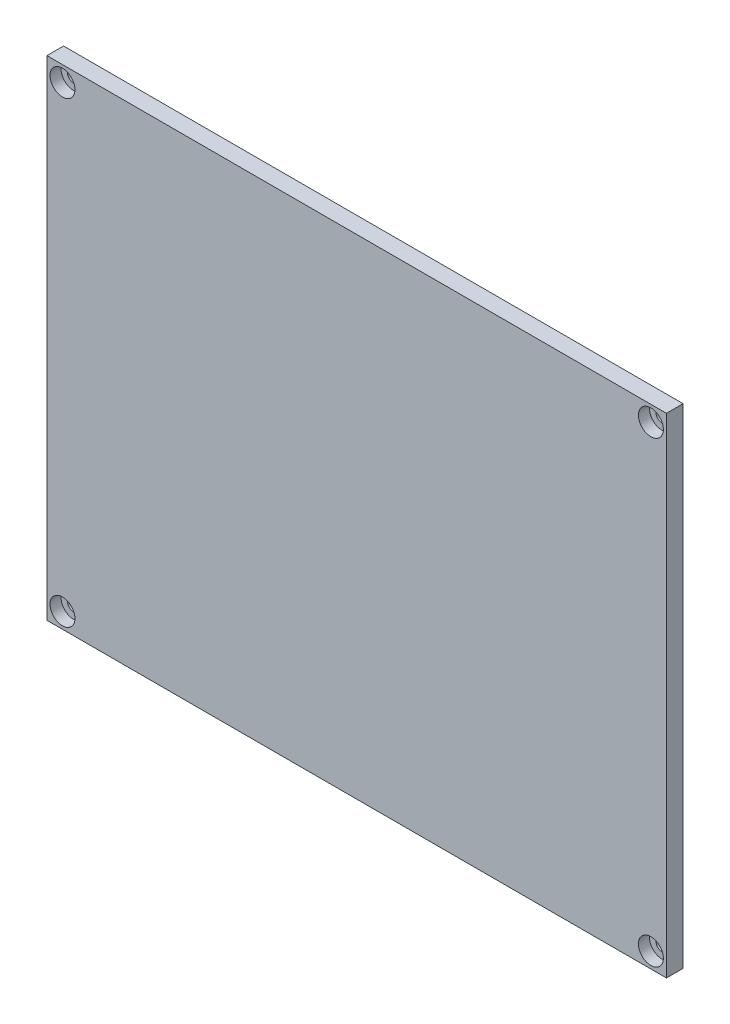
ISO-10303-21;
HEADER;
FILE_DESCRIPTION(('STEP AP214'),'2;1');
FILE_NAME('part.step','',(''),(''),'','','');
FILE_SCHEMA(('AUTOMOTIVE_DESIGN { 1 0 10303 214 1 1 1 1 }'));
ENDSEC;
DATA;
#1=APPLICATION_CONTEXT('core data for automotive mechanical design processes');
#2=APPLICATION_PROTOCOL_DEFINITION('international standard','automotive_design',2000,#1);
#3=PRODUCT_CONTEXT('',#1,'mechanical');
#4=PRODUCT('Part','Part','',(#3));
#5=PRODUCT_RELATED_PRODUCT_CATEGORY('part','',(#4));
#6=PRODUCT_DEFINITION_FORMATION('','',#4);
#7=PRODUCT_DEFINITION_CONTEXT('part definition',#1,'design');
#8=PRODUCT_DEFINITION('design','',#6,#7);
#9=PRODUCT_DEFINITION_SHAPE('','',#8);
#10=(LENGTH_UNIT() NAMED_UNIT(*) SI_UNIT(.MILLI.,.METRE.));
#11=(NAMED_UNIT(*) PLANE_ANGLE_UNIT() SI_UNIT($,.RADIAN.));
#12=(NAMED_UNIT(*) SI_UNIT($,.STERADIAN.) SOLID_ANGLE_UNIT());
#13=UNCERTAINTY_MEASURE_WITH_UNIT(LENGTH_MEASURE(1.E-05),#10,'distance_accuracy_value','');
#14=(GEOMETRIC_REPRESENTATION_CONTEXT(3) GLOBAL_UNCERTAINTY_ASSIGNED_CONTEXT((#13)) GLOBAL_UNIT_ASSIGNED_CONTEXT((#10,
#11,#12)) REPRESENTATION_CONTEXT('',''));
#15=CARTESIAN_POINT('',(0.,0.,0.));
#16=DIRECTION('',(0.,0.,1.));
#17=DIRECTION('',(1.,0.,0.));
#18=AXIS2_PLACEMENT_3D('',#15,#16,#17);
#19=CARTESIAN_POINT('',(-53.,41.25,0.));
#20=DIRECTION('',(0.,0.,1.));
#21=DIRECTION('',(1.,0.,0.));
#22=AXIS2_PLACEMENT_3D('',#19,#20,#21);
#23=CYLINDRICAL_SURFACE('',#22,1.10000000000001);
#24=CARTESIAN_POINT('',(-53.,41.25,0.));
#25=DIRECTION('',(0.,0.,1.));
#26=DIRECTION('',(1.,0.,0.));
#27=AXIS2_PLACEMENT_3D('',#24,#25,#26);
#28=CIRCLE('',#27,1.10000000000001);
#29=CARTESIAN_POINT('',(-51.9,41.25,0.));
#30=VERTEX_POINT('',#29);
#31=EDGE_CURVE('E11',#30,#30,#28,.T.);
#32=ORIENTED_EDGE('',*,*,#31,.F.);
#33=EDGE_LOOP('',(#32));
#34=FACE_BOUND('',#33,.T.);
#35=CARTESIAN_POINT('',(-53.,41.25,1.));
#36=DIRECTION('',(0.,0.,1.));
#37=DIRECTION('',(1.,0.,0.));
#38=AXIS2_PLACEMENT_3D('',#35,#36,#37);
#39=CIRCLE('',#38,1.10000000000001);
#40=CARTESIAN_POINT('',(-51.9,41.25,1.));
#41=VERTEX_POINT('',#40);
#42=EDGE_CURVE('E37',#41,#41,#39,.F.);
#43=ORIENTED_EDGE('',*,*,#42,.F.);
#44=EDGE_LOOP('',(#43));
#45=FACE_BOUND('',#44,.T.);
#46=ADVANCED_FACE('F33',(#34,#45),#23,.F.);
#47=CARTESIAN_POINT('',(53.,41.25,0.));
#48=DIRECTION('',(0.,0.,1.));
#49=DIRECTION('',(1.,0.,0.));
#50=AXIS2_PLACEMENT_3D('',#47,#48,#49);
#51=CYLINDRICAL_SURFACE('',#50,1.10000000000001);
#52=CARTESIAN_POINT('',(53.,41.25,0.));
#53=DIRECTION('',(0.,0.,1.));
#54=DIRECTION('',(1.,0.,0.));
#55=AXIS2_PLACEMENT_3D('',#52,#53,#54);
#56=CIRCLE('',#55,1.10000000000001);
#57=CARTESIAN_POINT('',(54.1,41.25,0.));
#58=VERTEX_POINT('',#57);
#59=EDGE_CURVE('E42',#58,#58,#56,.T.);
#60=ORIENTED_EDGE('',*,*,#59,.F.);
#61=EDGE_LOOP('',(#60));
#62=FACE_BOUND('',#61,.T.);
#63=CARTESIAN_POINT('',(53.,41.25,1.));
#64=DIRECTION('',(0.,0.,1.));
#65=DIRECTION('',(1.,0.,0.));
#66=AXIS2_PLACEMENT_3D('',#63,#64,#65);
#67=CIRCLE('',#66,1.10000000000001);
#68=CARTESIAN_POINT('',(54.1,41.25,1.));
#69=VERTEX_POINT('',#68);
#70=EDGE_CURVE('E123',#69,#69,#67,.F.);
#71=ORIENTED_EDGE('',*,*,#70,.F.);
#72=EDGE_LOOP('',(#71));
#73=FACE_BOUND('',#72,.T.);
#74=ADVANCED_FACE('F133',(#62,#73),#51,.F.);
#75=CARTESIAN_POINT('',(53.,-41.25,0.));
#76=DIRECTION('',(0.,0.,1.));
#77=DIRECTION('',(1.,0.,0.));
#78=AXIS2_PLACEMENT_3D('',#75,#76,#77);
#79=CYLINDRICAL_SURFACE('',#78,1.10000000000001);
#80=CARTESIAN_POINT('',(53.,-41.25,0.));
#81=DIRECTION('',(0.,0.,1.));
#82=DIRECTION('',(1.,0.,0.));
#83=AXIS2_PLACEMENT_3D('',#80,#81,#82);
#84=CIRCLE('',#83,1.10000000000001);
#85=CARTESIAN_POINT('',(54.1,-41.25,0.));
#86=VERTEX_POINT('',#85);
#87=EDGE_CURVE('E112',#86,#86,#84,.T.);
#88=ORIENTED_EDGE('',*,*,#87,.F.);
#89=EDGE_LOOP('',(#88));
#90=FACE_BOUND('',#89,.T.);
#91=CARTESIAN_POINT('',(53.,-41.25,1.));
#92=DIRECTION('',(0.,0.,1.));
#93=DIRECTION('',(1.,0.,0.));
#94=AXIS2_PLACEMENT_3D('',#91,#92,#93);
#95=CIRCLE('',#94,1.10000000000001);
#96=CARTESIAN_POINT('',(54.1,-41.25,1.));
#97=VERTEX_POINT('',#96);
#98=EDGE_CURVE('E120',#97,#97,#95,.F.);
#99=ORIENTED_EDGE('',*,*,#98,.F.);
#100=EDGE_LOOP('',(#99));
#101=FACE_BOUND('',#100,.T.);
#102=ADVANCED_FACE('F139',(#90,#101),#79,.F.);
#103=CARTESIAN_POINT('',(-53.,-41.25,0.));
#104=DIRECTION('',(0.,0.,1.));
#105=DIRECTION('',(1.,0.,0.));
#106=AXIS2_PLACEMENT_3D('',#103,#104,#105);
#107=CYLINDRICAL_SURFACE('',#106,1.10000000000001);
#108=CARTESIAN_POINT('',(-53.,-41.25,0.));
#109=DIRECTION('',(0.,0.,1.));
#110=DIRECTION('',(1.,0.,0.));
#111=AXIS2_PLACEMENT_3D('',#108,#109,#110);
#112=CIRCLE('',#111,1.10000000000001);
#113=CARTESIAN_POINT('',(-51.9,-41.25,0.));
#114=VERTEX_POINT('',#113);
#115=EDGE_CURVE('E107',#114,#114,#112,.T.);
#116=ORIENTED_EDGE('',*,*,#115,.F.);
#117=EDGE_LOOP('',(#116));
#118=FACE_BOUND('',#117,.T.);
#119=CARTESIAN_POINT('',(-53.,-41.25,1.));
#120=DIRECTION('',(0.,0.,1.));
#121=DIRECTION('',(1.,0.,0.));
#122=AXIS2_PLACEMENT_3D('',#119,#120,#121);
#123=CIRCLE('',#122,1.10000000000001);
#124=CARTESIAN_POINT('',(-51.9,-41.25,1.));
#125=VERTEX_POINT('',#124);
#126=EDGE_CURVE('E117',#125,#125,#123,.F.);
#127=ORIENTED_EDGE('',*,*,#126,.F.);
#128=EDGE_LOOP('',(#127));
#129=FACE_BOUND('',#128,.T.);
#130=ADVANCED_FACE('F144',(#118,#129),#107,.F.);
#131=CARTESIAN_POINT('',(0.,0.,3.));
#132=DIRECTION('',(0.,0.,-1.));
#133=DIRECTION('',(-1.,0.,0.));
#134=AXIS2_PLACEMENT_3D('',#131,#132,#133);
#135=PLANE('',#134);
#136=CARTESIAN_POINT('',(-53.,-41.25,3.));
#137=DIRECTION('',(0.,0.,1.));
#138=DIRECTION('',(1.,0.,0.));
#139=AXIS2_PLACEMENT_3D('',#136,#137,#138);
#140=CIRCLE('',#139,2.25);
#141=CARTESIAN_POINT('',(-50.75,-41.25,3.));
#142=VERTEX_POINT('',#141);
#143=EDGE_CURVE('E159',#142,#142,#140,.T.);
#144=ORIENTED_EDGE('',*,*,#143,.F.);
#145=EDGE_LOOP('',(#144));
#146=FACE_BOUND('',#145,.T.);
#147=CARTESIAN_POINT('',(53.,-41.25,3.));
#148=DIRECTION('',(0.,0.,1.));
#149=DIRECTION('',(1.,0.,0.));
#150=AXIS2_PLACEMENT_3D('',#147,#148,#149);
#151=CIRCLE('',#150,2.25);
#152=CARTESIAN_POINT('',(55.25,-41.25,3.));
#153=VERTEX_POINT('',#152);
#154=EDGE_CURVE('E163',#153,#153,#151,.T.);
#155=ORIENTED_EDGE('',*,*,#154,.F.);
#156=EDGE_LOOP('',(#155));
#157=FACE_BOUND('',#156,.T.);
#158=CARTESIAN_POINT('',(53.,41.25,3.));
#159=DIRECTION('',(0.,0.,1.));
#160=DIRECTION('',(1.,0.,0.));
#161=AXIS2_PLACEMENT_3D('',#158,#159,#160);
#162=CIRCLE('',#161,2.25);
#163=CARTESIAN_POINT('',(55.25,41.25,3.));
#164=VERTEX_POINT('',#163);
#165=EDGE_CURVE('E167',#164,#164,#162,.T.);
#166=ORIENTED_EDGE('',*,*,#165,.F.);
#167=EDGE_LOOP('',(#166));
#168=FACE_BOUND('',#167,.T.);
#169=CARTESIAN_POINT('',(-53.,41.25,3.));
#170=DIRECTION('',(0.,0.,1.));
#171=DIRECTION('',(1.,0.,0.));
#172=AXIS2_PLACEMENT_3D('',#169,#170,#171);
#173=CIRCLE('',#172,2.25);
#174=CARTESIAN_POINT('',(-50.75,41.25,3.));
#175=VERTEX_POINT('',#174);
#176=EDGE_CURVE('E171',#175,#175,#173,.T.);
#177=ORIENTED_EDGE('',*,*,#176,.F.);
#178=EDGE_LOOP('',(#177));
#179=FACE_BOUND('',#178,.T.);
#180=DIRECTION('',(0.,1.,0.));
#181=VECTOR('',#180,1.);
#182=CARTESIAN_POINT('',(55.8,-44.05,3.));
#183=LINE('',#182,#181);
#184=CARTESIAN_POINT('',(55.8,-44.05,3.));
#185=VERTEX_POINT('',#184);
#186=CARTESIAN_POINT('',(55.8,44.05,3.));
#187=VERTEX_POINT('',#186);
#188=EDGE_CURVE('E99',#185,#187,#183,.T.);
#189=ORIENTED_EDGE('',*,*,#188,.T.);
#190=DIRECTION('',(-1.,0.,0.));
#191=VECTOR('',#190,1.);
#192=CARTESIAN_POINT('',(-55.8,44.05,3.));
#193=LINE('',#192,#191);
#194=CARTESIAN_POINT('',(-55.8,44.05,3.));
#195=VERTEX_POINT('',#194);
#196=EDGE_CURVE('E102',#187,#195,#193,.T.);
#197=ORIENTED_EDGE('',*,*,#196,.T.);
#198=DIRECTION('',(0.,-1.,0.));
#199=VECTOR('',#198,1.);
#200=CARTESIAN_POINT('',(-55.8,-44.05,3.));
#201=LINE('',#200,#199);
#202=CARTESIAN_POINT('',(-55.8,-44.05,3.));
#203=VERTEX_POINT('',#202);
#204=EDGE_CURVE('E50',#195,#203,#201,.T.);
#205=ORIENTED_EDGE('',*,*,#204,.T.);
#206=DIRECTION('',(1.,0.,0.));
#207=VECTOR('',#206,1.);
#208=CARTESIAN_POINT('',(-55.8,-44.05,3.));
#209=LINE('',#208,#207);
#210=EDGE_CURVE('E82',#203,#185,#209,.T.);
#211=ORIENTED_EDGE('',*,*,#210,.T.);
#212=EDGE_LOOP('',(#189,#197,#205,#211));
#213=FACE_BOUND('',#212,.T.);
#214=ADVANCED_FACE('F146',(#146,#157,#168,#179,#213),#135,.F.);
#215=CARTESIAN_POINT('',(0.,0.,0.));
#216=DIRECTION('',(0.,0.,-1.));
#217=DIRECTION('',(-1.,0.,0.));
#218=AXIS2_PLACEMENT_3D('',#215,#216,#217);
#219=PLANE('',#218);
#220=ORIENTED_EDGE('',*,*,#31,.T.);
#221=EDGE_LOOP('',(#220));
#222=FACE_BOUND('',#221,.T.);
#223=ORIENTED_EDGE('',*,*,#59,.T.);
#224=EDGE_LOOP('',(#223));
#225=FACE_BOUND('',#224,.T.);
#226=ORIENTED_EDGE('',*,*,#87,.T.);
#227=EDGE_LOOP('',(#226));
#228=FACE_BOUND('',#227,.T.);
#229=ORIENTED_EDGE('',*,*,#115,.T.);
#230=EDGE_LOOP('',(#229));
#231=FACE_BOUND('',#230,.T.);
#232=DIRECTION('',(-1.,0.,0.));
#233=VECTOR('',#232,1.);
#234=CARTESIAN_POINT('',(-55.8,44.05,0.));
#235=LINE('',#234,#233);
#236=CARTESIAN_POINT('',(55.8,44.05,0.));
#237=VERTEX_POINT('',#236);
#238=CARTESIAN_POINT('',(-55.8,44.05,0.));
#239=VERTEX_POINT('',#238);
#240=EDGE_CURVE('E92',#237,#239,#235,.T.);
#241=ORIENTED_EDGE('',*,*,#240,.F.);
#242=DIRECTION('',(0.,1.,0.));
#243=VECTOR('',#242,1.);
#244=CARTESIAN_POINT('',(55.8,-44.05,0.));
#245=LINE('',#244,#243);
#246=CARTESIAN_POINT('',(55.8,-44.05,0.));
#247=VERTEX_POINT('',#246);
#248=EDGE_CURVE('E58',#247,#237,#245,.T.);
#249=ORIENTED_EDGE('',*,*,#248,.F.);
#250=DIRECTION('',(1.,0.,0.));
#251=VECTOR('',#250,1.);
#252=CARTESIAN_POINT('',(-55.8,-44.05,0.));
#253=LINE('',#252,#251);
#254=CARTESIAN_POINT('',(-55.8,-44.05,0.));
#255=VERTEX_POINT('',#254);
#256=EDGE_CURVE('E80',#255,#247,#253,.T.);
#257=ORIENTED_EDGE('',*,*,#256,.F.);
#258=DIRECTION('',(0.,-1.,0.));
#259=VECTOR('',#258,1.);
#260=CARTESIAN_POINT('',(-55.8,-44.05,0.));
#261=LINE('',#260,#259);
#262=EDGE_CURVE('E87',#239,#255,#261,.T.);
#263=ORIENTED_EDGE('',*,*,#262,.F.);
#264=EDGE_LOOP('',(#241,#249,#257,#263));
#265=FACE_BOUND('',#264,.T.);
#266=ADVANCED_FACE('F35',(#222,#225,#228,#231,#265),#219,.T.);
#267=CARTESIAN_POINT('',(55.8,-44.05,0.));
#268=DIRECTION('',(1.,0.,0.));
#269=DIRECTION('',(0.,0.,-1.));
#270=AXIS2_PLACEMENT_3D('',#267,#268,#269);
#271=PLANE('',#270);
#272=ORIENTED_EDGE('',*,*,#188,.F.);
#273=DIRECTION('',(0.,0.,1.));
#274=VECTOR('',#273,1.);
#275=CARTESIAN_POINT('',(55.8,-44.05,0.));
#276=LINE('',#275,#274);
#277=EDGE_CURVE('E83',#247,#185,#276,.T.);
#278=ORIENTED_EDGE('',*,*,#277,.F.);
#279=ORIENTED_EDGE('',*,*,#248,.T.);
#280=DIRECTION('',(0.,0.,1.));
#281=VECTOR('',#280,1.);
#282=CARTESIAN_POINT('',(55.8,44.05,0.));
#283=LINE('',#282,#281);
#284=EDGE_CURVE('E94',#237,#187,#283,.T.);
#285=ORIENTED_EDGE('',*,*,#284,.T.);
#286=EDGE_LOOP('',(#272,#278,#279,#285));
#287=FACE_BOUND('',#286,.T.);
#288=ADVANCED_FACE('F153',(#287),#271,.T.);
#289=CARTESIAN_POINT('',(-55.8,-44.05,0.));
#290=DIRECTION('',(0.,-1.,0.));
#291=DIRECTION('',(0.,0.,-1.));
#292=AXIS2_PLACEMENT_3D('',#289,#290,#291);
#293=PLANE('',#292);
#294=ORIENTED_EDGE('',*,*,#210,.F.);
#295=DIRECTION('',(0.,0.,1.));
#296=VECTOR('',#295,1.);
#297=CARTESIAN_POINT('',(-55.8,-44.05,0.));
#298=LINE('',#297,#296);
#299=EDGE_CURVE('E76',#255,#203,#298,.T.);
#300=ORIENTED_EDGE('',*,*,#299,.F.);
#301=ORIENTED_EDGE('',*,*,#256,.T.);
#302=ORIENTED_EDGE('',*,*,#277,.T.);
#303=EDGE_LOOP('',(#294,#300,#301,#302));
#304=FACE_BOUND('',#303,.T.);
#305=ADVANCED_FACE('F78',(#304),#293,.T.);
#306=CARTESIAN_POINT('',(-55.8,-44.05,0.));
#307=DIRECTION('',(-1.,0.,0.));
#308=DIRECTION('',(0.,0.,1.));
#309=AXIS2_PLACEMENT_3D('',#306,#307,#308);
#310=PLANE('',#309);
#311=ORIENTED_EDGE('',*,*,#204,.F.);
#312=DIRECTION('',(0.,0.,1.));
#313=VECTOR('',#312,1.);
#314=CARTESIAN_POINT('',(-55.8,44.05,0.));
#315=LINE('',#314,#313);
#316=EDGE_CURVE('E84',#239,#195,#315,.T.);
#317=ORIENTED_EDGE('',*,*,#316,.F.);
#318=ORIENTED_EDGE('',*,*,#262,.T.);
#319=ORIENTED_EDGE('',*,*,#299,.T.);
#320=EDGE_LOOP('',(#311,#317,#318,#319));
#321=FACE_BOUND('',#320,.T.);
#322=ADVANCED_FACE('F88',(#321),#310,.T.);
#323=CARTESIAN_POINT('',(-55.8,44.05,0.));
#324=DIRECTION('',(0.,1.,0.));
#325=DIRECTION('',(0.,0.,1.));
#326=AXIS2_PLACEMENT_3D('',#323,#324,#325);
#327=PLANE('',#326);
#328=ORIENTED_EDGE('',*,*,#196,.F.);
#329=ORIENTED_EDGE('',*,*,#284,.F.);
#330=ORIENTED_EDGE('',*,*,#240,.T.);
#331=ORIENTED_EDGE('',*,*,#316,.T.);
#332=EDGE_LOOP('',(#328,#329,#330,#331));
#333=FACE_BOUND('',#332,.T.);
#334=ADVANCED_FACE('F175',(#333),#327,.T.);
#335=CARTESIAN_POINT('',(-53.,-41.25,1.));
#336=DIRECTION('',(0.,0.,1.));
#337=DIRECTION('',(1.,0.,0.));
#338=AXIS2_PLACEMENT_3D('',#335,#336,#337);
#339=PLANE('',#338);
#340=CARTESIAN_POINT('',(-53.,-41.25,1.));
#341=DIRECTION('',(0.,0.,1.));
#342=DIRECTION('',(1.,0.,0.));
#343=AXIS2_PLACEMENT_3D('',#340,#341,#342);
#344=CIRCLE('',#343,2.25);
#345=CARTESIAN_POINT('',(-50.75,-41.25,1.));
#346=VERTEX_POINT('',#345);
#347=EDGE_CURVE('E183',#346,#346,#344,.T.);
#348=ORIENTED_EDGE('',*,*,#347,.T.);
#349=EDGE_LOOP('',(#348));
#350=FACE_BOUND('',#349,.T.);
#351=ORIENTED_EDGE('',*,*,#126,.T.);
#352=EDGE_LOOP('',(#351));
#353=FACE_BOUND('',#352,.T.);
#354=ADVANCED_FACE('F218',(#350,#353),#339,.T.);
#355=CARTESIAN_POINT('',(-53.,-41.25,1.));
#356=DIRECTION('',(0.,0.,1.));
#357=DIRECTION('',(1.,0.,0.));
#358=AXIS2_PLACEMENT_3D('',#355,#356,#357);
#359=CYLINDRICAL_SURFACE('',#358,2.25);
#360=ORIENTED_EDGE('',*,*,#347,.F.);
#361=EDGE_LOOP('',(#360));
#362=FACE_BOUND('',#361,.T.);
#363=ORIENTED_EDGE('',*,*,#143,.T.);
#364=EDGE_LOOP('',(#363));
#365=FACE_BOUND('',#364,.T.);
#366=ADVANCED_FACE('F213',(#362,#365),#359,.F.);
#367=CARTESIAN_POINT('',(53.,-41.25,1.));
#368=DIRECTION('',(0.,0.,1.));
#369=DIRECTION('',(1.,0.,0.));
#370=AXIS2_PLACEMENT_3D('',#367,#368,#369);
#371=PLANE('',#370);
#372=CARTESIAN_POINT('',(53.,-41.25,1.));
#373=DIRECTION('',(0.,0.,1.));
#374=DIRECTION('',(1.,0.,0.));
#375=AXIS2_PLACEMENT_3D('',#372,#373,#374);
#376=CIRCLE('',#375,2.25);
#377=CARTESIAN_POINT('',(55.25,-41.25,1.));
#378=VERTEX_POINT('',#377);
#379=EDGE_CURVE('E187',#378,#378,#376,.T.);
#380=ORIENTED_EDGE('',*,*,#379,.T.);
#381=EDGE_LOOP('',(#380));
#382=FACE_BOUND('',#381,.T.);
#383=ORIENTED_EDGE('',*,*,#98,.T.);
#384=EDGE_LOOP('',(#383));
#385=FACE_BOUND('',#384,.T.);
#386=ADVANCED_FACE('F210',(#382,#385),#371,.T.);
#387=CARTESIAN_POINT('',(53.,-41.25,1.));
#388=DIRECTION('',(0.,0.,1.));
#389=DIRECTION('',(1.,0.,0.));
#390=AXIS2_PLACEMENT_3D('',#387,#388,#389);
#391=CYLINDRICAL_SURFACE('',#390,2.25);
#392=ORIENTED_EDGE('',*,*,#379,.F.);
#393=EDGE_LOOP('',(#392));
#394=FACE_BOUND('',#393,.T.);
#395=ORIENTED_EDGE('',*,*,#154,.T.);
#396=EDGE_LOOP('',(#395));
#397=FACE_BOUND('',#396,.T.);
#398=ADVANCED_FACE('F207',(#394,#397),#391,.F.);
#399=CARTESIAN_POINT('',(53.,41.25,1.));
#400=DIRECTION('',(0.,0.,1.));
#401=DIRECTION('',(1.,0.,0.));
#402=AXIS2_PLACEMENT_3D('',#399,#400,#401);
#403=PLANE('',#402);
#404=CARTESIAN_POINT('',(53.,41.25,1.));
#405=DIRECTION('',(0.,0.,1.));
#406=DIRECTION('',(1.,0.,0.));
#407=AXIS2_PLACEMENT_3D('',#404,#405,#406);
#408=CIRCLE('',#407,2.25);
#409=CARTESIAN_POINT('',(55.25,41.25,1.));
#410=VERTEX_POINT('',#409);
#411=EDGE_CURVE('E179',#410,#410,#408,.T.);
#412=ORIENTED_EDGE('',*,*,#411,.T.);
#413=EDGE_LOOP('',(#412));
#414=FACE_BOUND('',#413,.T.);
#415=ORIENTED_EDGE('',*,*,#70,.T.);
#416=EDGE_LOOP('',(#415));
#417=FACE_BOUND('',#416,.T.);
#418=ADVANCED_FACE('F194',(#414,#417),#403,.T.);
#419=CARTESIAN_POINT('',(53.,41.25,1.));
#420=DIRECTION('',(0.,0.,1.));
#421=DIRECTION('',(1.,0.,0.));
#422=AXIS2_PLACEMENT_3D('',#419,#420,#421);
#423=CYLINDRICAL_SURFACE('',#422,2.25);
#424=ORIENTED_EDGE('',*,*,#411,.F.);
#425=EDGE_LOOP('',(#424));
#426=FACE_BOUND('',#425,.T.);
#427=ORIENTED_EDGE('',*,*,#165,.T.);
#428=EDGE_LOOP('',(#427));
#429=FACE_BOUND('',#428,.T.);
#430=ADVANCED_FACE('F196',(#426,#429),#423,.F.);
#431=CARTESIAN_POINT('',(-53.,41.25,1.));
#432=DIRECTION('',(0.,0.,1.));
#433=DIRECTION('',(1.,0.,0.));
#434=AXIS2_PLACEMENT_3D('',#431,#432,#433);
#435=PLANE('',#434);
#436=CARTESIAN_POINT('',(-53.,41.25,1.));
#437=DIRECTION('',(0.,0.,1.));
#438=DIRECTION('',(1.,0.,0.));
#439=AXIS2_PLACEMENT_3D('',#436,#437,#438);
#440=CIRCLE('',#439,2.25);
#441=CARTESIAN_POINT('',(-50.75,41.25,1.));
#442=VERTEX_POINT('',#441);
#443=EDGE_CURVE('E121',#442,#442,#440,.T.);
#444=ORIENTED_EDGE('',*,*,#443,.T.);
#445=EDGE_LOOP('',(#444));
#446=FACE_BOUND('',#445,.T.);
#447=ORIENTED_EDGE('',*,*,#42,.T.);
#448=EDGE_LOOP('',(#447));
#449=FACE_BOUND('',#448,.T.);
#450=ADVANCED_FACE('F130',(#446,#449),#435,.T.);
#451=CARTESIAN_POINT('',(-53.,41.25,1.));
#452=DIRECTION('',(0.,0.,1.));
#453=DIRECTION('',(1.,0.,0.));
#454=AXIS2_PLACEMENT_3D('',#451,#452,#453);
#455=CYLINDRICAL_SURFACE('',#454,2.25);
#456=ORIENTED_EDGE('',*,*,#443,.F.);
#457=EDGE_LOOP('',(#456));
#458=FACE_BOUND('',#457,.T.);
#459=ORIENTED_EDGE('',*,*,#176,.T.);
#460=EDGE_LOOP('',(#459));
#461=FACE_BOUND('',#460,.T.);
#462=ADVANCED_FACE('F204',(#458,#461),#455,.F.);
#463=CLOSED_SHELL('',(#46,#74,#102,#130,#214,#266,#288,#305,#322,#334,#354,#366,#386,#398,#418,
#430,#450,#462));
#464=MANIFOLD_SOLID_BREP('B2',#463);
#465=ADVANCED_BREP_SHAPE_REPRESENTATION('',(#18,#464),#14);
#466=SHAPE_DEFINITION_REPRESENTATION(#9,#465);
ENDSEC;
END-ISO-10303-21;
